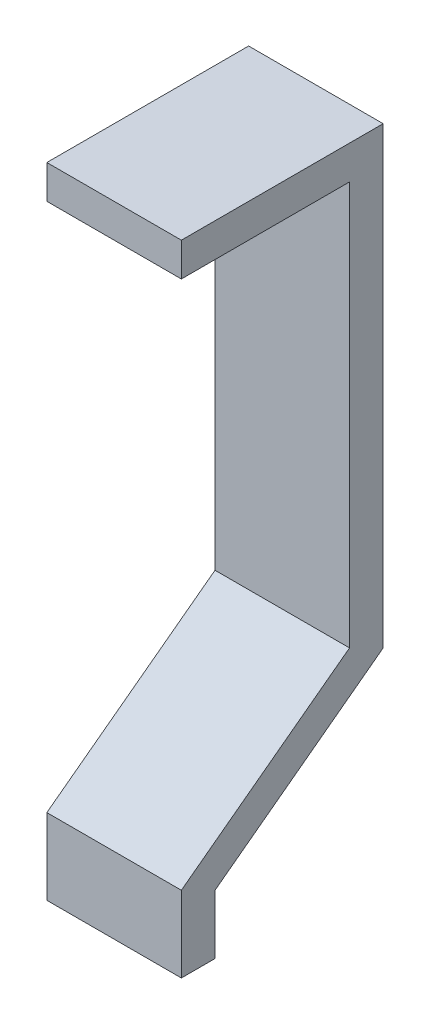
ISO-10303-21;
HEADER;
FILE_DESCRIPTION(('STEP AP214'),'2;1');
FILE_NAME('part.step','',(''),(''),'','','');
FILE_SCHEMA(('AUTOMOTIVE_DESIGN { 1 0 10303 214 1 1 1 1 }'));
ENDSEC;
DATA;
#1=APPLICATION_CONTEXT('core data for automotive mechanical design processes');
#2=APPLICATION_PROTOCOL_DEFINITION('international standard','automotive_design',2000,#1);
#3=PRODUCT_CONTEXT('',#1,'mechanical');
#4=PRODUCT('Part','Part','',(#3));
#5=PRODUCT_RELATED_PRODUCT_CATEGORY('part','',(#4));
#6=PRODUCT_DEFINITION_FORMATION('','',#4);
#7=PRODUCT_DEFINITION_CONTEXT('part definition',#1,'design');
#8=PRODUCT_DEFINITION('design','',#6,#7);
#9=PRODUCT_DEFINITION_SHAPE('','',#8);
#10=(LENGTH_UNIT() NAMED_UNIT(*) SI_UNIT(.MILLI.,.METRE.));
#11=(NAMED_UNIT(*) PLANE_ANGLE_UNIT() SI_UNIT($,.RADIAN.));
#12=(NAMED_UNIT(*) SI_UNIT($,.STERADIAN.) SOLID_ANGLE_UNIT());
#13=UNCERTAINTY_MEASURE_WITH_UNIT(LENGTH_MEASURE(1.E-05),#10,'distance_accuracy_value','');
#14=(GEOMETRIC_REPRESENTATION_CONTEXT(3) GLOBAL_UNCERTAINTY_ASSIGNED_CONTEXT((#13)) GLOBAL_UNIT_ASSIGNED_CONTEXT((#10,
#11,#12)) REPRESENTATION_CONTEXT('',''));
#15=CARTESIAN_POINT('',(0.,0.,0.));
#16=DIRECTION('',(0.,0.,1.));
#17=DIRECTION('',(1.,0.,0.));
#18=AXIS2_PLACEMENT_3D('',#15,#16,#17);
#19=CARTESIAN_POINT('',(40.,190.,10.));
#20=DIRECTION('',(0.,0.,-1.));
#21=DIRECTION('',(0.,1.,0.));
#22=AXIS2_PLACEMENT_3D('',#19,#20,#21);
#23=PLANE('',#22);
#24=DIRECTION('',(0.,-1.,0.));
#25=VECTOR('',#24,1.);
#26=CARTESIAN_POINT('',(0.,190.,10.));
#27=LINE('',#26,#25);
#28=CARTESIAN_POINT('',(0.,190.,10.));
#29=VERTEX_POINT('',#28);
#30=CARTESIAN_POINT('',(0.,180.,10.));
#31=VERTEX_POINT('',#30);
#32=EDGE_CURVE('E145',#29,#31,#27,.T.);
#33=ORIENTED_EDGE('',*,*,#32,.T.);
#34=DIRECTION('',(-1.,0.,0.));
#35=VECTOR('',#34,1.);
#36=CARTESIAN_POINT('',(40.,180.,10.));
#37=LINE('',#36,#35);
#38=CARTESIAN_POINT('',(40.,180.,10.));
#39=VERTEX_POINT('',#38);
#40=EDGE_CURVE('E11',#39,#31,#37,.T.);
#41=ORIENTED_EDGE('',*,*,#40,.F.);
#42=DIRECTION('',(0.,-1.,0.));
#43=VECTOR('',#42,1.);
#44=CARTESIAN_POINT('',(40.,190.,10.));
#45=LINE('',#44,#43);
#46=CARTESIAN_POINT('',(40.,190.,10.));
#47=VERTEX_POINT('',#46);
#48=EDGE_CURVE('E163',#47,#39,#45,.T.);
#49=ORIENTED_EDGE('',*,*,#48,.F.);
#50=DIRECTION('',(-1.,0.,0.));
#51=VECTOR('',#50,1.);
#52=CARTESIAN_POINT('',(40.,190.,10.));
#53=LINE('',#52,#51);
#54=EDGE_CURVE('E141',#47,#29,#53,.T.);
#55=ORIENTED_EDGE('',*,*,#54,.T.);
#56=EDGE_LOOP('',(#33,#41,#49,#55));
#57=FACE_BOUND('',#56,.T.);
#58=ADVANCED_FACE('F37',(#57),#23,.F.);
#59=CARTESIAN_POINT('',(40.,180.,-40.));
#60=DIRECTION('',(0.,1.,0.));
#61=DIRECTION('',(0.,0.,1.));
#62=AXIS2_PLACEMENT_3D('',#59,#60,#61);
#63=PLANE('',#62);
#64=DIRECTION('',(0.,0.,-1.));
#65=VECTOR('',#64,1.);
#66=CARTESIAN_POINT('',(0.,180.,-40.));
#67=LINE('',#66,#65);
#68=CARTESIAN_POINT('',(0.,180.,-40.));
#69=VERTEX_POINT('',#68);
#70=EDGE_CURVE('E148',#31,#69,#67,.T.);
#71=ORIENTED_EDGE('',*,*,#70,.T.);
#72=DIRECTION('',(-1.,0.,0.));
#73=VECTOR('',#72,1.);
#74=CARTESIAN_POINT('',(40.,180.,-40.));
#75=LINE('',#74,#73);
#76=CARTESIAN_POINT('',(40.,180.,-40.));
#77=VERTEX_POINT('',#76);
#78=EDGE_CURVE('E45',#77,#69,#75,.T.);
#79=ORIENTED_EDGE('',*,*,#78,.F.);
#80=DIRECTION('',(0.,0.,-1.));
#81=VECTOR('',#80,1.);
#82=CARTESIAN_POINT('',(40.,180.,-40.));
#83=LINE('',#82,#81);
#84=EDGE_CURVE('E102',#39,#77,#83,.T.);
#85=ORIENTED_EDGE('',*,*,#84,.F.);
#86=ORIENTED_EDGE('',*,*,#40,.T.);
#87=EDGE_LOOP('',(#71,#79,#85,#86));
#88=FACE_BOUND('',#87,.T.);
#89=ADVANCED_FACE('F212',(#88),#63,.F.);
#90=CARTESIAN_POINT('',(40.,60.,-40.));
#91=DIRECTION('',(0.,0.,-1.));
#92=DIRECTION('',(0.,1.,0.));
#93=AXIS2_PLACEMENT_3D('',#90,#91,#92);
#94=PLANE('',#93);
#95=DIRECTION('',(0.,-1.,0.));
#96=VECTOR('',#95,1.);
#97=CARTESIAN_POINT('',(0.,60.,-40.));
#98=LINE('',#97,#96);
#99=CARTESIAN_POINT('',(0.,60.,-40.));
#100=VERTEX_POINT('',#99);
#101=EDGE_CURVE('E150',#69,#100,#98,.T.);
#102=ORIENTED_EDGE('',*,*,#101,.T.);
#103=DIRECTION('',(-1.,0.,0.));
#104=VECTOR('',#103,1.);
#105=CARTESIAN_POINT('',(40.,60.,-40.));
#106=LINE('',#105,#104);
#107=CARTESIAN_POINT('',(40.,60.,-40.));
#108=VERTEX_POINT('',#107);
#109=EDGE_CURVE('E176',#108,#100,#106,.T.);
#110=ORIENTED_EDGE('',*,*,#109,.F.);
#111=DIRECTION('',(0.,-1.,0.));
#112=VECTOR('',#111,1.);
#113=CARTESIAN_POINT('',(40.,60.,-40.));
#114=LINE('',#113,#112);
#115=EDGE_CURVE('E184',#77,#108,#114,.T.);
#116=ORIENTED_EDGE('',*,*,#115,.F.);
#117=ORIENTED_EDGE('',*,*,#78,.T.);
#118=EDGE_LOOP('',(#102,#110,#116,#117));
#119=FACE_BOUND('',#118,.T.);
#120=ADVANCED_FACE('F182',(#119),#94,.F.);
#121=CARTESIAN_POINT('',(40.,22.5986149027904,9.99999999999999));
#122=DIRECTION('',(0.,-0.800757440986473,-0.598988748395824));
#123=DIRECTION('',(0.,0.598988748395824,-0.800757440986473));
#124=AXIS2_PLACEMENT_3D('',#121,#122,#123);
#125=PLANE('',#124);
#126=DIRECTION('',(0.,-0.598988748395824,0.800757440986473));
#127=VECTOR('',#126,1.);
#128=CARTESIAN_POINT('',(0.,22.5986149027904,9.99999999999999));
#129=LINE('',#128,#127);
#130=CARTESIAN_POINT('',(0.,22.5986149027904,9.99999999999999));
#131=VERTEX_POINT('',#130);
#132=EDGE_CURVE('E152',#100,#131,#129,.T.);
#133=ORIENTED_EDGE('',*,*,#132,.T.);
#134=DIRECTION('',(-1.,0.,0.));
#135=VECTOR('',#134,1.);
#136=CARTESIAN_POINT('',(40.,22.5986149027904,9.99999999999999));
#137=LINE('',#136,#135);
#138=CARTESIAN_POINT('',(40.,22.5986149027904,9.99999999999999));
#139=VERTEX_POINT('',#138);
#140=EDGE_CURVE('E173',#139,#131,#137,.T.);
#141=ORIENTED_EDGE('',*,*,#140,.F.);
#142=DIRECTION('',(0.,-0.598988748395824,0.800757440986473));
#143=VECTOR('',#142,1.);
#144=CARTESIAN_POINT('',(40.,22.5986149027904,9.99999999999999));
#145=LINE('',#144,#143);
#146=EDGE_CURVE('E202',#108,#139,#145,.T.);
#147=ORIENTED_EDGE('',*,*,#146,.F.);
#148=ORIENTED_EDGE('',*,*,#109,.T.);
#149=EDGE_LOOP('',(#133,#141,#147,#148));
#150=FACE_BOUND('',#149,.T.);
#151=ADVANCED_FACE('F193',(#150),#125,.F.);
#152=CARTESIAN_POINT('',(40.,0.,9.99999999999999));
#153=DIRECTION('',(0.,0.,-1.));
#154=DIRECTION('',(-1.,0.,0.));
#155=AXIS2_PLACEMENT_3D('',#152,#153,#154);
#156=PLANE('',#155);
#157=DIRECTION('',(0.,-1.,0.));
#158=VECTOR('',#157,1.);
#159=CARTESIAN_POINT('',(0.,0.,9.99999999999999));
#160=LINE('',#159,#158);
#161=CARTESIAN_POINT('',(0.,0.,9.99999999999999));
#162=VERTEX_POINT('',#161);
#163=EDGE_CURVE('E154',#131,#162,#160,.T.);
#164=ORIENTED_EDGE('',*,*,#163,.T.);
#165=DIRECTION('',(-1.,0.,0.));
#166=VECTOR('',#165,1.);
#167=CARTESIAN_POINT('',(40.,0.,9.99999999999999));
#168=LINE('',#167,#166);
#169=CARTESIAN_POINT('',(40.,0.,9.99999999999999));
#170=VERTEX_POINT('',#169);
#171=EDGE_CURVE('E170',#170,#162,#168,.T.);
#172=ORIENTED_EDGE('',*,*,#171,.F.);
#173=DIRECTION('',(0.,-1.,0.));
#174=VECTOR('',#173,1.);
#175=CARTESIAN_POINT('',(40.,0.,9.99999999999999));
#176=LINE('',#175,#174);
#177=EDGE_CURVE('E199',#139,#170,#176,.T.);
#178=ORIENTED_EDGE('',*,*,#177,.F.);
#179=ORIENTED_EDGE('',*,*,#140,.T.);
#180=EDGE_LOOP('',(#164,#172,#178,#179));
#181=FACE_BOUND('',#180,.T.);
#182=ADVANCED_FACE('F197',(#181),#156,.F.);
#183=CARTESIAN_POINT('',(40.,0.,0.));
#184=DIRECTION('',(0.,1.,0.));
#185=DIRECTION('',(0.,0.,1.));
#186=AXIS2_PLACEMENT_3D('',#183,#184,#185);
#187=PLANE('',#186);
#188=DIRECTION('',(0.,0.,-1.));
#189=VECTOR('',#188,1.);
#190=CARTESIAN_POINT('',(0.,0.,0.));
#191=LINE('',#190,#189);
#192=CARTESIAN_POINT('',(0.,0.,0.));
#193=VERTEX_POINT('',#192);
#194=EDGE_CURVE('E156',#162,#193,#191,.T.);
#195=ORIENTED_EDGE('',*,*,#194,.T.);
#196=DIRECTION('',(-1.,0.,0.));
#197=VECTOR('',#196,1.);
#198=CARTESIAN_POINT('',(40.,0.,0.));
#199=LINE('',#198,#197);
#200=CARTESIAN_POINT('',(40.,0.,0.));
#201=VERTEX_POINT('',#200);
#202=EDGE_CURVE('E167',#201,#193,#199,.T.);
#203=ORIENTED_EDGE('',*,*,#202,.F.);
#204=DIRECTION('',(0.,0.,-1.));
#205=VECTOR('',#204,1.);
#206=CARTESIAN_POINT('',(40.,0.,0.));
#207=LINE('',#206,#205);
#208=EDGE_CURVE('E201',#170,#201,#207,.T.);
#209=ORIENTED_EDGE('',*,*,#208,.F.);
#210=ORIENTED_EDGE('',*,*,#171,.T.);
#211=EDGE_LOOP('',(#195,#203,#209,#210));
#212=FACE_BOUND('',#211,.T.);
#213=ADVANCED_FACE('F224',(#212),#187,.F.);
#214=CARTESIAN_POINT('',(40.,17.590715742838,0.));
#215=DIRECTION('',(0.,0.,1.));
#216=DIRECTION('',(0.,-1.,0.));
#217=AXIS2_PLACEMENT_3D('',#214,#215,#216);
#218=PLANE('',#217);
#219=DIRECTION('',(0.,1.,0.));
#220=VECTOR('',#219,1.);
#221=CARTESIAN_POINT('',(0.,17.590715742838,0.));
#222=LINE('',#221,#220);
#223=CARTESIAN_POINT('',(0.,17.590715742838,0.));
#224=VERTEX_POINT('',#223);
#225=EDGE_CURVE('E158',#193,#224,#222,.T.);
#226=ORIENTED_EDGE('',*,*,#225,.T.);
#227=DIRECTION('',(-1.,0.,0.));
#228=VECTOR('',#227,1.);
#229=CARTESIAN_POINT('',(40.,17.590715742838,0.));
#230=LINE('',#229,#228);
#231=CARTESIAN_POINT('',(40.,17.590715742838,0.));
#232=VERTEX_POINT('',#231);
#233=EDGE_CURVE('E136',#232,#224,#230,.T.);
#234=ORIENTED_EDGE('',*,*,#233,.F.);
#235=DIRECTION('',(0.,1.,0.));
#236=VECTOR('',#235,1.);
#237=CARTESIAN_POINT('',(40.,17.590715742838,0.));
#238=LINE('',#237,#236);
#239=EDGE_CURVE('E127',#201,#232,#238,.T.);
#240=ORIENTED_EDGE('',*,*,#239,.F.);
#241=ORIENTED_EDGE('',*,*,#202,.T.);
#242=EDGE_LOOP('',(#226,#234,#240,#241));
#243=FACE_BOUND('',#242,.T.);
#244=ADVANCED_FACE('F227',(#243),#218,.F.);
#245=CARTESIAN_POINT('',(40.,54.9921008400476,-50.));
#246=DIRECTION('',(0.,0.800757440986473,0.598988748395824));
#247=DIRECTION('',(0.,-0.598988748395824,0.800757440986473));
#248=AXIS2_PLACEMENT_3D('',#245,#246,#247);
#249=PLANE('',#248);
#250=DIRECTION('',(0.,0.598988748395824,-0.800757440986473));
#251=VECTOR('',#250,1.);
#252=CARTESIAN_POINT('',(0.,54.9921008400476,-50.));
#253=LINE('',#252,#251);
#254=CARTESIAN_POINT('',(0.,54.9921008400476,-50.));
#255=VERTEX_POINT('',#254);
#256=EDGE_CURVE('E135',#224,#255,#253,.T.);
#257=ORIENTED_EDGE('',*,*,#256,.T.);
#258=DIRECTION('',(-1.,0.,0.));
#259=VECTOR('',#258,1.);
#260=CARTESIAN_POINT('',(40.,54.9921008400476,-50.));
#261=LINE('',#260,#259);
#262=CARTESIAN_POINT('',(40.,54.9921008400476,-50.));
#263=VERTEX_POINT('',#262);
#264=EDGE_CURVE('E132',#263,#255,#261,.T.);
#265=ORIENTED_EDGE('',*,*,#264,.F.);
#266=DIRECTION('',(0.,0.598988748395824,-0.800757440986473));
#267=VECTOR('',#266,1.);
#268=CARTESIAN_POINT('',(40.,54.9921008400476,-50.));
#269=LINE('',#268,#267);
#270=EDGE_CURVE('E121',#232,#263,#269,.T.);
#271=ORIENTED_EDGE('',*,*,#270,.F.);
#272=ORIENTED_EDGE('',*,*,#233,.T.);
#273=EDGE_LOOP('',(#257,#265,#271,#272));
#274=FACE_BOUND('',#273,.T.);
#275=ADVANCED_FACE('F133',(#274),#249,.F.);
#276=CARTESIAN_POINT('',(40.,190.,-50.));
#277=DIRECTION('',(0.,0.,1.));
#278=DIRECTION('',(1.,0.,0.));
#279=AXIS2_PLACEMENT_3D('',#276,#277,#278);
#280=PLANE('',#279);
#281=DIRECTION('',(0.,1.,0.));
#282=VECTOR('',#281,1.);
#283=CARTESIAN_POINT('',(0.,190.,-50.));
#284=LINE('',#283,#282);
#285=CARTESIAN_POINT('',(0.,190.,-50.));
#286=VERTEX_POINT('',#285);
#287=EDGE_CURVE('E88',#255,#286,#284,.T.);
#288=ORIENTED_EDGE('',*,*,#287,.T.);
#289=DIRECTION('',(-1.,0.,0.));
#290=VECTOR('',#289,1.);
#291=CARTESIAN_POINT('',(40.,190.,-50.));
#292=LINE('',#291,#290);
#293=CARTESIAN_POINT('',(40.,190.,-50.));
#294=VERTEX_POINT('',#293);
#295=EDGE_CURVE('E137',#294,#286,#292,.T.);
#296=ORIENTED_EDGE('',*,*,#295,.F.);
#297=DIRECTION('',(0.,1.,0.));
#298=VECTOR('',#297,1.);
#299=CARTESIAN_POINT('',(40.,190.,-50.));
#300=LINE('',#299,#298);
#301=EDGE_CURVE('E125',#263,#294,#300,.T.);
#302=ORIENTED_EDGE('',*,*,#301,.F.);
#303=ORIENTED_EDGE('',*,*,#264,.T.);
#304=EDGE_LOOP('',(#288,#296,#302,#303));
#305=FACE_BOUND('',#304,.T.);
#306=ADVANCED_FACE('F139',(#305),#280,.F.);
#307=CARTESIAN_POINT('',(40.,190.,10.));
#308=DIRECTION('',(0.,-1.,0.));
#309=DIRECTION('',(0.,0.,-1.));
#310=AXIS2_PLACEMENT_3D('',#307,#308,#309);
#311=PLANE('',#310);
#312=DIRECTION('',(0.,0.,1.));
#313=VECTOR('',#312,1.);
#314=CARTESIAN_POINT('',(0.,190.,10.));
#315=LINE('',#314,#313);
#316=EDGE_CURVE('E94',#286,#29,#315,.T.);
#317=ORIENTED_EDGE('',*,*,#316,.T.);
#318=ORIENTED_EDGE('',*,*,#54,.F.);
#319=DIRECTION('',(0.,0.,1.));
#320=VECTOR('',#319,1.);
#321=CARTESIAN_POINT('',(40.,190.,10.));
#322=LINE('',#321,#320);
#323=EDGE_CURVE('E53',#294,#47,#322,.T.);
#324=ORIENTED_EDGE('',*,*,#323,.F.);
#325=ORIENTED_EDGE('',*,*,#295,.T.);
#326=EDGE_LOOP('',(#317,#318,#324,#325));
#327=FACE_BOUND('',#326,.T.);
#328=ADVANCED_FACE('F236',(#327),#311,.F.);
#329=CARTESIAN_POINT('',(40.,0.,0.));
#330=DIRECTION('',(-1.,0.,0.));
#331=DIRECTION('',(0.,0.,1.));
#332=AXIS2_PLACEMENT_3D('',#329,#330,#331);
#333=PLANE('',#332);
#334=ORIENTED_EDGE('',*,*,#48,.T.);
#335=ORIENTED_EDGE('',*,*,#84,.T.);
#336=ORIENTED_EDGE('',*,*,#115,.T.);
#337=ORIENTED_EDGE('',*,*,#146,.T.);
#338=ORIENTED_EDGE('',*,*,#177,.T.);
#339=ORIENTED_EDGE('',*,*,#208,.T.);
#340=ORIENTED_EDGE('',*,*,#239,.T.);
#341=ORIENTED_EDGE('',*,*,#270,.T.);
#342=ORIENTED_EDGE('',*,*,#301,.T.);
#343=ORIENTED_EDGE('',*,*,#323,.T.);
#344=EDGE_LOOP('',(#334,#335,#336,#337,#338,#339,#340,#341,#342,#343));
#345=FACE_BOUND('',#344,.T.);
#346=ADVANCED_FACE('F123',(#345),#333,.F.);
#347=CARTESIAN_POINT('',(0.,0.,0.));
#348=DIRECTION('',(-1.,0.,0.));
#349=DIRECTION('',(0.,0.,1.));
#350=AXIS2_PLACEMENT_3D('',#347,#348,#349);
#351=PLANE('',#350);
#352=ORIENTED_EDGE('',*,*,#32,.F.);
#353=ORIENTED_EDGE('',*,*,#316,.F.);
#354=ORIENTED_EDGE('',*,*,#287,.F.);
#355=ORIENTED_EDGE('',*,*,#256,.F.);
#356=ORIENTED_EDGE('',*,*,#225,.F.);
#357=ORIENTED_EDGE('',*,*,#194,.F.);
#358=ORIENTED_EDGE('',*,*,#163,.F.);
#359=ORIENTED_EDGE('',*,*,#132,.F.);
#360=ORIENTED_EDGE('',*,*,#101,.F.);
#361=ORIENTED_EDGE('',*,*,#70,.F.);
#362=EDGE_LOOP('',(#352,#353,#354,#355,#356,#357,#358,#359,#360,#361));
#363=FACE_BOUND('',#362,.T.);
#364=ADVANCED_FACE('F188',(#363),#351,.T.);
#365=CLOSED_SHELL('',(#58,#89,#120,#151,#182,#213,#244,#275,#306,#328,#346,#364));
#366=MANIFOLD_SOLID_BREP('B2',#365);
#367=ADVANCED_BREP_SHAPE_REPRESENTATION('',(#18,#366),#14);
#368=SHAPE_DEFINITION_REPRESENTATION(#9,#367);
ENDSEC;
END-ISO-10303-21;
